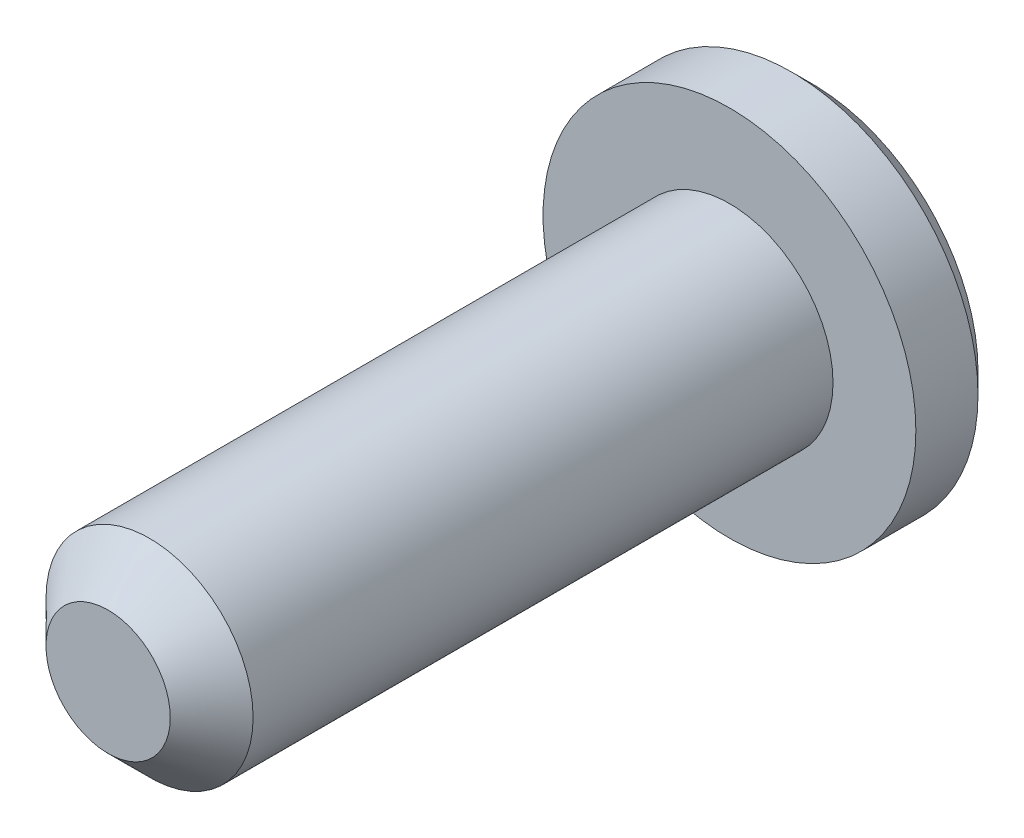
ISO-10303-21;
HEADER;
FILE_DESCRIPTION(('STEP AP214'),'2;1');
FILE_NAME('part.step','',(''),(''),'','','');
FILE_SCHEMA(('AUTOMOTIVE_DESIGN { 1 0 10303 214 1 1 1 1 }'));
ENDSEC;
DATA;
#1=APPLICATION_CONTEXT('core data for automotive mechanical design processes');
#2=APPLICATION_PROTOCOL_DEFINITION('international standard','automotive_design',2000,#1);
#3=PRODUCT_CONTEXT('',#1,'mechanical');
#4=PRODUCT('Part','Part','',(#3));
#5=PRODUCT_RELATED_PRODUCT_CATEGORY('part','',(#4));
#6=PRODUCT_DEFINITION_FORMATION('','',#4);
#7=PRODUCT_DEFINITION_CONTEXT('part definition',#1,'design');
#8=PRODUCT_DEFINITION('design','',#6,#7);
#9=PRODUCT_DEFINITION_SHAPE('','',#8);
#10=(LENGTH_UNIT() NAMED_UNIT(*) SI_UNIT(.MILLI.,.METRE.));
#11=(NAMED_UNIT(*) PLANE_ANGLE_UNIT() SI_UNIT($,.RADIAN.));
#12=(NAMED_UNIT(*) SI_UNIT($,.STERADIAN.) SOLID_ANGLE_UNIT());
#13=UNCERTAINTY_MEASURE_WITH_UNIT(LENGTH_MEASURE(1.E-05),#10,'distance_accuracy_value','');
#14=(GEOMETRIC_REPRESENTATION_CONTEXT(3) GLOBAL_UNCERTAINTY_ASSIGNED_CONTEXT((#13)) GLOBAL_UNIT_ASSIGNED_CONTEXT((#10,
#11,#12)) REPRESENTATION_CONTEXT('',''));
#15=CARTESIAN_POINT('',(0.,0.,0.));
#16=DIRECTION('',(0.,0.,1.));
#17=DIRECTION('',(1.,0.,0.));
#18=AXIS2_PLACEMENT_3D('',#15,#16,#17);
#19=CARTESIAN_POINT('',(0.,0.,-4.));
#20=DIRECTION('',(0.,0.,1.));
#21=DIRECTION('',(1.,0.,0.));
#22=AXIS2_PLACEMENT_3D('',#19,#20,#21);
#23=CYLINDRICAL_SURFACE('',#22,9.);
#24=CARTESIAN_POINT('',(0.,0.,-2.99999999999999));
#25=DIRECTION('',(0.,0.,1.));
#26=DIRECTION('',(1.,0.,0.));
#27=AXIS2_PLACEMENT_3D('',#24,#25,#26);
#28=CIRCLE('',#27,9.);
#29=CARTESIAN_POINT('',(9.,0.,-2.99999999999999));
#30=VERTEX_POINT('',#29);
#31=EDGE_CURVE('E38',#30,#30,#28,.T.);
#32=ORIENTED_EDGE('',*,*,#31,.T.);
#33=EDGE_LOOP('',(#32));
#34=FACE_BOUND('',#33,.T.);
#35=CARTESIAN_POINT('',(0.,0.,0.));
#36=DIRECTION('',(0.,0.,1.));
#37=DIRECTION('',(1.,0.,0.));
#38=AXIS2_PLACEMENT_3D('',#35,#36,#37);
#39=CIRCLE('',#38,9.);
#40=CARTESIAN_POINT('',(9.,0.,0.));
#41=VERTEX_POINT('',#40);
#42=EDGE_CURVE('E44',#41,#41,#39,.T.);
#43=ORIENTED_EDGE('',*,*,#42,.F.);
#44=EDGE_LOOP('',(#43));
#45=FACE_BOUND('',#44,.T.);
#46=ADVANCED_FACE('F24',(#34,#45),#23,.T.);
#47=CARTESIAN_POINT('',(0.,0.,-4.));
#48=DIRECTION('',(0.,0.,1.));
#49=DIRECTION('',(1.,0.,0.));
#50=AXIS2_PLACEMENT_3D('',#47,#48,#49);
#51=PLANE('',#50);
#52=CARTESIAN_POINT('',(0.,0.,-4.));
#53=DIRECTION('',(0.,0.,1.));
#54=DIRECTION('',(1.,0.,0.));
#55=AXIS2_PLACEMENT_3D('',#52,#53,#54);
#56=CIRCLE('',#55,7.99999999999998);
#57=CARTESIAN_POINT('',(7.99999999999998,0.,-4.));
#58=VERTEX_POINT('',#57);
#59=EDGE_CURVE('E34',#58,#58,#56,.F.);
#60=ORIENTED_EDGE('',*,*,#59,.T.);
#61=EDGE_LOOP('',(#60));
#62=FACE_BOUND('',#61,.T.);
#63=ADVANCED_FACE('F55',(#62),#51,.F.);
#64=CARTESIAN_POINT('',(0.,0.,0.));
#65=DIRECTION('',(0.,0.,1.));
#66=DIRECTION('',(1.,0.,0.));
#67=AXIS2_PLACEMENT_3D('',#64,#65,#66);
#68=PLANE('',#67);
#69=CARTESIAN_POINT('',(0.,0.,0.));
#70=DIRECTION('',(0.,0.,1.));
#71=DIRECTION('',(1.,0.,0.));
#72=AXIS2_PLACEMENT_3D('',#69,#70,#71);
#73=CIRCLE('',#72,5.);
#74=CARTESIAN_POINT('',(5.,0.,0.));
#75=VERTEX_POINT('',#74);
#76=EDGE_CURVE('E43',#75,#75,#73,.T.);
#77=ORIENTED_EDGE('',*,*,#76,.F.);
#78=EDGE_LOOP('',(#77));
#79=FACE_BOUND('',#78,.T.);
#80=ORIENTED_EDGE('',*,*,#42,.T.);
#81=EDGE_LOOP('',(#80));
#82=FACE_BOUND('',#81,.T.);
#83=ADVANCED_FACE('F52',(#79,#82),#68,.T.);
#84=CARTESIAN_POINT('',(0.,0.,30.));
#85=DIRECTION('',(0.,0.,-1.));
#86=DIRECTION('',(-1.,0.,0.));
#87=AXIS2_PLACEMENT_3D('',#84,#85,#86);
#88=CYLINDRICAL_SURFACE('',#87,5.);
#89=CARTESIAN_POINT('',(0.,0.,28.));
#90=DIRECTION('',(0.,0.,1.));
#91=DIRECTION('',(1.,0.,0.));
#92=AXIS2_PLACEMENT_3D('',#89,#90,#91);
#93=CIRCLE('',#92,5.);
#94=CARTESIAN_POINT('',(5.,0.,28.));
#95=VERTEX_POINT('',#94);
#96=EDGE_CURVE('E10',#95,#95,#93,.F.);
#97=ORIENTED_EDGE('',*,*,#96,.T.);
#98=EDGE_LOOP('',(#97));
#99=FACE_BOUND('',#98,.T.);
#100=ORIENTED_EDGE('',*,*,#76,.T.);
#101=EDGE_LOOP('',(#100));
#102=FACE_BOUND('',#101,.T.);
#103=ADVANCED_FACE('F50',(#99,#102),#88,.T.);
#104=CARTESIAN_POINT('',(0.,0.,30.));
#105=DIRECTION('',(0.,0.,1.));
#106=DIRECTION('',(1.,0.,0.));
#107=AXIS2_PLACEMENT_3D('',#104,#105,#106);
#108=PLANE('',#107);
#109=CARTESIAN_POINT('',(0.,0.,30.));
#110=DIRECTION('',(0.,0.,1.));
#111=DIRECTION('',(1.,0.,0.));
#112=AXIS2_PLACEMENT_3D('',#109,#110,#111);
#113=CIRCLE('',#112,2.99999999999996);
#114=CARTESIAN_POINT('',(2.99999999999996,0.,30.));
#115=VERTEX_POINT('',#114);
#116=EDGE_CURVE('E30',#115,#115,#113,.T.);
#117=ORIENTED_EDGE('',*,*,#116,.T.);
#118=EDGE_LOOP('',(#117));
#119=FACE_BOUND('',#118,.T.);
#120=ADVANCED_FACE('F70',(#119),#108,.T.);
#121=CARTESIAN_POINT('',(0.,0.,-2.99999999999999));
#122=DIRECTION('',(0.,0.,1.));
#123=DIRECTION('',(1.,0.,0.));
#124=AXIS2_PLACEMENT_3D('',#121,#122,#123);
#125=CONICAL_SURFACE('',#124,9.,0.785398163397454);
#126=ORIENTED_EDGE('',*,*,#59,.F.);
#127=EDGE_LOOP('',(#126));
#128=FACE_BOUND('',#127,.T.);
#129=ORIENTED_EDGE('',*,*,#31,.F.);
#130=EDGE_LOOP('',(#129));
#131=FACE_BOUND('',#130,.T.);
#132=ADVANCED_FACE('F67',(#128,#131),#125,.T.);
#133=CARTESIAN_POINT('',(0.,0.,30.));
#134=DIRECTION('',(0.,0.,-1.));
#135=DIRECTION('',(-1.,0.,0.));
#136=AXIS2_PLACEMENT_3D('',#133,#134,#135);
#137=CONICAL_SURFACE('',#136,2.99999999999996,0.785398163397453);
#138=ORIENTED_EDGE('',*,*,#96,.F.);
#139=EDGE_LOOP('',(#138));
#140=FACE_BOUND('',#139,.T.);
#141=ORIENTED_EDGE('',*,*,#116,.F.);
#142=EDGE_LOOP('',(#141));
#143=FACE_BOUND('',#142,.T.);
#144=ADVANCED_FACE('F69',(#140,#143),#137,.T.);
#145=CLOSED_SHELL('',(#46,#63,#83,#103,#120,#132,#144));
#146=MANIFOLD_SOLID_BREP('B2',#145);
#147=ADVANCED_BREP_SHAPE_REPRESENTATION('',(#18,#146),#14);
#148=SHAPE_DEFINITION_REPRESENTATION(#9,#147);
ENDSEC;
END-ISO-10303-21;
